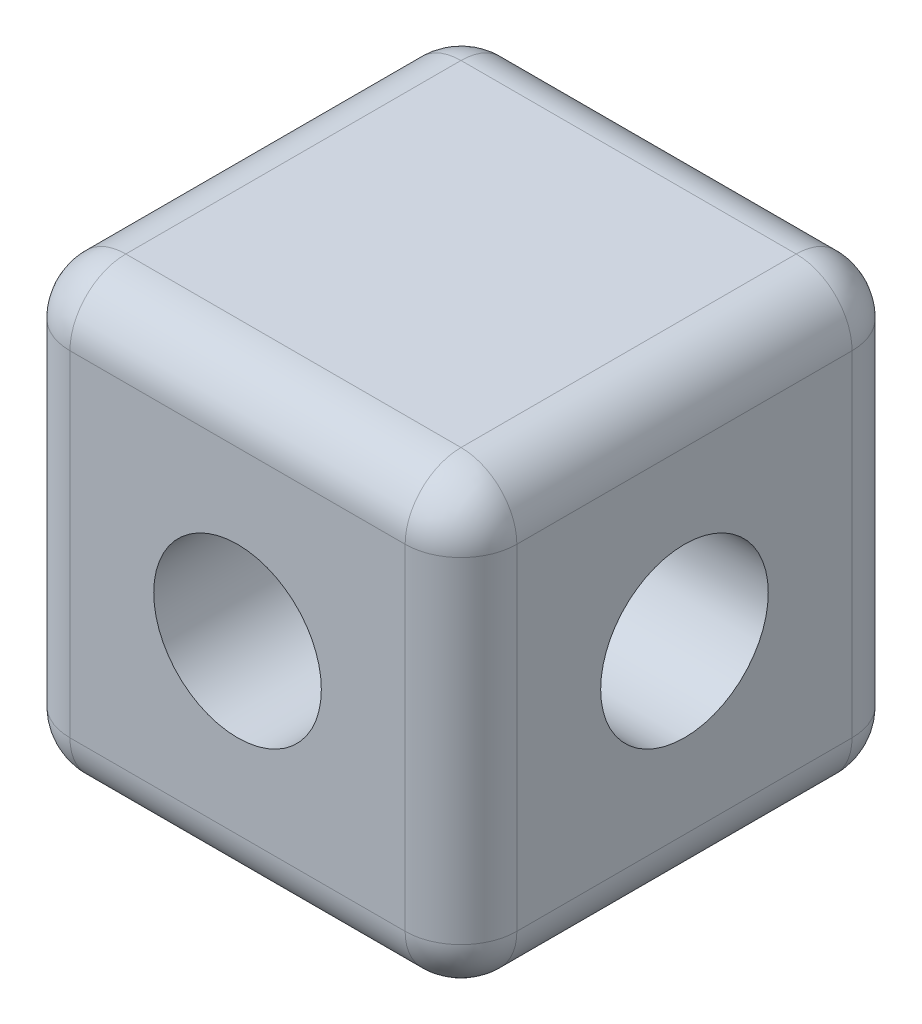
ISO-10303-21;
HEADER;
FILE_DESCRIPTION(('STEP AP214'),'2;1');
FILE_NAME('part.step','',(''),(''),'','','');
FILE_SCHEMA(('AUTOMOTIVE_DESIGN { 1 0 10303 214 1 1 1 1 }'));
ENDSEC;
DATA;
#1=APPLICATION_CONTEXT('core data for automotive mechanical design processes');
#2=APPLICATION_PROTOCOL_DEFINITION('international standard','automotive_design',2000,#1);
#3=PRODUCT_CONTEXT('',#1,'mechanical');
#4=PRODUCT('Part','Part','',(#3));
#5=PRODUCT_RELATED_PRODUCT_CATEGORY('part','',(#4));
#6=PRODUCT_DEFINITION_FORMATION('','',#4);
#7=PRODUCT_DEFINITION_CONTEXT('part definition',#1,'design');
#8=PRODUCT_DEFINITION('design','',#6,#7);
#9=PRODUCT_DEFINITION_SHAPE('','',#8);
#10=(LENGTH_UNIT() NAMED_UNIT(*) SI_UNIT(.MILLI.,.METRE.));
#11=(NAMED_UNIT(*) PLANE_ANGLE_UNIT() SI_UNIT($,.RADIAN.));
#12=(NAMED_UNIT(*) SI_UNIT($,.STERADIAN.) SOLID_ANGLE_UNIT());
#13=UNCERTAINTY_MEASURE_WITH_UNIT(LENGTH_MEASURE(1.E-05),#10,'distance_accuracy_value','');
#14=(GEOMETRIC_REPRESENTATION_CONTEXT(3) GLOBAL_UNCERTAINTY_ASSIGNED_CONTEXT((#13)) GLOBAL_UNIT_ASSIGNED_CONTEXT((#10,
#11,#12)) REPRESENTATION_CONTEXT('',''));
#15=CARTESIAN_POINT('',(0.,0.,0.));
#16=DIRECTION('',(0.,0.,1.));
#17=DIRECTION('',(1.,0.,0.));
#18=AXIS2_PLACEMENT_3D('',#15,#16,#17);
#19=CARTESIAN_POINT('',(0.,2.,-2.001));
#20=DIRECTION('',(0.,0.,1.));
#21=DIRECTION('',(1.,0.,0.));
#22=AXIS2_PLACEMENT_3D('',#19,#20,#21);
#23=CYLINDRICAL_SURFACE('',#22,0.75);
#24=CARTESIAN_POINT('',(0.,2.,2.));
#25=DIRECTION('',(0.,0.,1.));
#26=DIRECTION('',(1.,0.,0.));
#27=AXIS2_PLACEMENT_3D('',#24,#25,#26);
#28=CIRCLE('',#27,0.75);
#29=CARTESIAN_POINT('',(0.750000000000001,2.,2.));
#30=VERTEX_POINT('',#29);
#31=EDGE_CURVE('E276',#30,#30,#28,.T.);
#32=ORIENTED_EDGE('',*,*,#31,.T.);
#33=EDGE_LOOP('',(#32));
#34=FACE_BOUND('',#33,.T.);
#35=CARTESIAN_POINT('',(0.,2.,0.));
#36=DIRECTION('',(0.707106781186547,0.,0.707106781186547));
#37=DIRECTION('',(-0.707106781186547,0.,0.707106781186547));
#38=AXIS2_PLACEMENT_3D('',#35,#36,#37);
#39=ELLIPSE('',#38,1.06066017177982,0.75);
#40=CARTESIAN_POINT('',(0.,1.25,0.));
#41=VERTEX_POINT('',#40);
#42=CARTESIAN_POINT('',(0.,2.75,0.));
#43=VERTEX_POINT('',#42);
#44=EDGE_CURVE('E49',#41,#43,#39,.F.);
#45=ORIENTED_EDGE('',*,*,#44,.T.);
#46=CARTESIAN_POINT('',(0.,2.,0.));
#47=DIRECTION('',(-0.707106781186547,0.,0.707106781186547));
#48=DIRECTION('',(0.707106781186547,0.,0.707106781186547));
#49=AXIS2_PLACEMENT_3D('',#46,#47,#48);
#50=ELLIPSE('',#49,1.06066017177982,0.75);
#51=EDGE_CURVE('E11',#43,#41,#50,.F.);
#52=ORIENTED_EDGE('',*,*,#51,.T.);
#53=EDGE_LOOP('',(#45,#52));
#54=FACE_BOUND('',#53,.T.);
#55=ADVANCED_FACE('F36',(#34,#54),#23,.F.);
#56=CARTESIAN_POINT('',(-1.5,0.5,2.));
#57=DIRECTION('',(0.,0.,-1.));
#58=DIRECTION('',(-1.,0.,0.));
#59=AXIS2_PLACEMENT_3D('',#56,#57,#58);
#60=CYLINDRICAL_SURFACE('',#59,0.5);
#61=CARTESIAN_POINT('',(-1.5,0.5,1.5));
#62=DIRECTION('',(0.,0.,1.));
#63=DIRECTION('',(1.,0.,0.));
#64=AXIS2_PLACEMENT_3D('',#61,#62,#63);
#65=CIRCLE('',#64,0.5);
#66=CARTESIAN_POINT('',(-2.,0.5,1.5));
#67=VERTEX_POINT('',#66);
#68=CARTESIAN_POINT('',(-1.5,0.,1.5));
#69=VERTEX_POINT('',#68);
#70=EDGE_CURVE('E139',#67,#69,#65,.T.);
#71=ORIENTED_EDGE('',*,*,#70,.F.);
#72=DIRECTION('',(0.,0.,1.));
#73=VECTOR('',#72,1.);
#74=CARTESIAN_POINT('',(-2.,0.5,2.));
#75=LINE('',#74,#73);
#76=CARTESIAN_POINT('',(-2.,0.5,-1.5));
#77=VERTEX_POINT('',#76);
#78=EDGE_CURVE('E161',#77,#67,#75,.T.);
#79=ORIENTED_EDGE('',*,*,#78,.F.);
#80=CARTESIAN_POINT('',(-1.5,0.5,-1.5));
#81=DIRECTION('',(0.,0.,1.));
#82=DIRECTION('',(1.,0.,0.));
#83=AXIS2_PLACEMENT_3D('',#80,#81,#82);
#84=CIRCLE('',#83,0.5);
#85=CARTESIAN_POINT('',(-1.5,0.,-1.5));
#86=VERTEX_POINT('',#85);
#87=EDGE_CURVE('E57',#77,#86,#84,.T.);
#88=ORIENTED_EDGE('',*,*,#87,.T.);
#89=DIRECTION('',(0.,0.,1.));
#90=VECTOR('',#89,1.);
#91=CARTESIAN_POINT('',(-1.5,0.,2.));
#92=LINE('',#91,#90);
#93=EDGE_CURVE('E188',#69,#86,#92,.F.);
#94=ORIENTED_EDGE('',*,*,#93,.F.);
#95=EDGE_LOOP('',(#71,#79,#88,#94));
#96=FACE_BOUND('',#95,.T.);
#97=ADVANCED_FACE('F38',(#96),#60,.T.);
#98=CARTESIAN_POINT('',(-1.5,0.5,-1.5));
#99=DIRECTION('',(0.,-1.,0.));
#100=DIRECTION('',(0.,0.,-1.));
#101=AXIS2_PLACEMENT_3D('',#98,#99,#100);
#102=SPHERICAL_SURFACE('',#101,0.5);
#103=ORIENTED_EDGE('',*,*,#87,.F.);
#104=CARTESIAN_POINT('',(-1.5,0.5,-1.5));
#105=DIRECTION('',(0.,-1.,0.));
#106=DIRECTION('',(0.,0.,-1.));
#107=AXIS2_PLACEMENT_3D('',#104,#105,#106);
#108=CIRCLE('',#107,0.5);
#109=CARTESIAN_POINT('',(-1.5,0.5,-2.));
#110=VERTEX_POINT('',#109);
#111=EDGE_CURVE('E164',#110,#77,#108,.F.);
#112=ORIENTED_EDGE('',*,*,#111,.F.);
#113=CARTESIAN_POINT('',(-1.5,0.5,-1.5));
#114=DIRECTION('',(-1.,0.,0.));
#115=DIRECTION('',(0.,0.,1.));
#116=AXIS2_PLACEMENT_3D('',#113,#114,#115);
#117=CIRCLE('',#116,0.5);
#118=EDGE_CURVE('E146',#110,#86,#117,.T.);
#119=ORIENTED_EDGE('',*,*,#118,.T.);
#120=EDGE_LOOP('',(#103,#112,#119));
#121=FACE_BOUND('',#120,.T.);
#122=ADVANCED_FACE('F301',(#121),#102,.T.);
#123=CARTESIAN_POINT('',(-2.,0.5,-1.5));
#124=DIRECTION('',(1.,0.,0.));
#125=DIRECTION('',(0.,0.,-1.));
#126=AXIS2_PLACEMENT_3D('',#123,#124,#125);
#127=CYLINDRICAL_SURFACE('',#126,0.5);
#128=ORIENTED_EDGE('',*,*,#118,.F.);
#129=DIRECTION('',(-1.,0.,0.));
#130=VECTOR('',#129,1.);
#131=CARTESIAN_POINT('',(-2.,0.5,-2.));
#132=LINE('',#131,#130);
#133=CARTESIAN_POINT('',(1.5,0.5,-2.));
#134=VERTEX_POINT('',#133);
#135=EDGE_CURVE('E167',#134,#110,#132,.T.);
#136=ORIENTED_EDGE('',*,*,#135,.F.);
#137=CARTESIAN_POINT('',(1.5,0.5,-1.5));
#138=DIRECTION('',(-1.,0.,0.));
#139=DIRECTION('',(0.,0.,1.));
#140=AXIS2_PLACEMENT_3D('',#137,#138,#139);
#141=CIRCLE('',#140,0.5);
#142=CARTESIAN_POINT('',(1.5,0.,-1.5));
#143=VERTEX_POINT('',#142);
#144=EDGE_CURVE('E148',#134,#143,#141,.T.);
#145=ORIENTED_EDGE('',*,*,#144,.T.);
#146=DIRECTION('',(-1.,0.,0.));
#147=VECTOR('',#146,1.);
#148=CARTESIAN_POINT('',(-2.,0.,-1.5));
#149=LINE('',#148,#147);
#150=EDGE_CURVE('E185',#86,#143,#149,.F.);
#151=ORIENTED_EDGE('',*,*,#150,.F.);
#152=EDGE_LOOP('',(#128,#136,#145,#151));
#153=FACE_BOUND('',#152,.T.);
#154=ADVANCED_FACE('F398',(#153),#127,.T.);
#155=CARTESIAN_POINT('',(1.5,0.5,-1.5));
#156=DIRECTION('',(0.,-1.,0.));
#157=DIRECTION('',(0.,0.,-1.));
#158=AXIS2_PLACEMENT_3D('',#155,#156,#157);
#159=SPHERICAL_SURFACE('',#158,0.5);
#160=ORIENTED_EDGE('',*,*,#144,.F.);
#161=CARTESIAN_POINT('',(1.5,0.5,-1.5));
#162=DIRECTION('',(0.,1.,0.));
#163=DIRECTION('',(0.,0.,1.));
#164=AXIS2_PLACEMENT_3D('',#161,#162,#163);
#165=CIRCLE('',#164,0.5);
#166=CARTESIAN_POINT('',(2.,0.5,-1.5));
#167=VERTEX_POINT('',#166);
#168=EDGE_CURVE('E170',#167,#134,#165,.T.);
#169=ORIENTED_EDGE('',*,*,#168,.F.);
#170=CARTESIAN_POINT('',(1.5,0.5,-1.5));
#171=DIRECTION('',(0.,0.,-1.));
#172=DIRECTION('',(-1.,0.,0.));
#173=AXIS2_PLACEMENT_3D('',#170,#171,#172);
#174=CIRCLE('',#173,0.5);
#175=EDGE_CURVE('E150',#167,#143,#174,.T.);
#176=ORIENTED_EDGE('',*,*,#175,.T.);
#177=EDGE_LOOP('',(#160,#169,#176));
#178=FACE_BOUND('',#177,.T.);
#179=ADVANCED_FACE('F394',(#178),#159,.T.);
#180=CARTESIAN_POINT('',(1.5,0.5,-2.));
#181=DIRECTION('',(0.,0.,1.));
#182=DIRECTION('',(1.,0.,0.));
#183=AXIS2_PLACEMENT_3D('',#180,#181,#182);
#184=CYLINDRICAL_SURFACE('',#183,0.5);
#185=ORIENTED_EDGE('',*,*,#175,.F.);
#186=DIRECTION('',(0.,0.,-1.));
#187=VECTOR('',#186,1.);
#188=CARTESIAN_POINT('',(2.,0.5,-2.));
#189=LINE('',#188,#187);
#190=CARTESIAN_POINT('',(2.,0.5,1.5));
#191=VERTEX_POINT('',#190);
#192=EDGE_CURVE('E173',#191,#167,#189,.T.);
#193=ORIENTED_EDGE('',*,*,#192,.F.);
#194=CARTESIAN_POINT('',(1.5,0.5,1.5));
#195=DIRECTION('',(0.,0.,-1.));
#196=DIRECTION('',(-1.,0.,0.));
#197=AXIS2_PLACEMENT_3D('',#194,#195,#196);
#198=CIRCLE('',#197,0.5);
#199=CARTESIAN_POINT('',(1.5,0.,1.5));
#200=VERTEX_POINT('',#199);
#201=EDGE_CURVE('E153',#191,#200,#198,.T.);
#202=ORIENTED_EDGE('',*,*,#201,.T.);
#203=DIRECTION('',(0.,0.,-1.));
#204=VECTOR('',#203,1.);
#205=CARTESIAN_POINT('',(1.5,0.,-2.));
#206=LINE('',#205,#204);
#207=EDGE_CURVE('E182',#143,#200,#206,.F.);
#208=ORIENTED_EDGE('',*,*,#207,.F.);
#209=EDGE_LOOP('',(#185,#193,#202,#208));
#210=FACE_BOUND('',#209,.T.);
#211=ADVANCED_FACE('F390',(#210),#184,.T.);
#212=CARTESIAN_POINT('',(1.5,0.5,1.5));
#213=DIRECTION('',(0.,-1.,0.));
#214=DIRECTION('',(0.,0.,-1.));
#215=AXIS2_PLACEMENT_3D('',#212,#213,#214);
#216=SPHERICAL_SURFACE('',#215,0.5);
#217=ORIENTED_EDGE('',*,*,#201,.F.);
#218=CARTESIAN_POINT('',(1.5,0.5,1.5));
#219=DIRECTION('',(0.,1.,0.));
#220=DIRECTION('',(0.,0.,1.));
#221=AXIS2_PLACEMENT_3D('',#218,#219,#220);
#222=CIRCLE('',#221,0.5);
#223=CARTESIAN_POINT('',(1.5,0.5,2.));
#224=VERTEX_POINT('',#223);
#225=EDGE_CURVE('E176',#224,#191,#222,.T.);
#226=ORIENTED_EDGE('',*,*,#225,.F.);
#227=CARTESIAN_POINT('',(1.5,0.5,1.5));
#228=DIRECTION('',(1.,0.,0.));
#229=DIRECTION('',(0.,0.,-1.));
#230=AXIS2_PLACEMENT_3D('',#227,#228,#229);
#231=CIRCLE('',#230,0.5);
#232=EDGE_CURVE('E155',#224,#200,#231,.T.);
#233=ORIENTED_EDGE('',*,*,#232,.T.);
#234=EDGE_LOOP('',(#217,#226,#233));
#235=FACE_BOUND('',#234,.T.);
#236=ADVANCED_FACE('F386',(#235),#216,.T.);
#237=CARTESIAN_POINT('',(2.,0.5,1.5));
#238=DIRECTION('',(-1.,0.,0.));
#239=DIRECTION('',(0.,0.,1.));
#240=AXIS2_PLACEMENT_3D('',#237,#238,#239);
#241=CYLINDRICAL_SURFACE('',#240,0.5);
#242=ORIENTED_EDGE('',*,*,#232,.F.);
#243=DIRECTION('',(1.,0.,0.));
#244=VECTOR('',#243,1.);
#245=CARTESIAN_POINT('',(2.,0.5,2.));
#246=LINE('',#245,#244);
#247=CARTESIAN_POINT('',(-1.5,0.5,2.));
#248=VERTEX_POINT('',#247);
#249=EDGE_CURVE('E191',#248,#224,#246,.T.);
#250=ORIENTED_EDGE('',*,*,#249,.F.);
#251=CARTESIAN_POINT('',(-1.5,0.5,1.5));
#252=DIRECTION('',(1.,0.,0.));
#253=DIRECTION('',(0.,0.,-1.));
#254=AXIS2_PLACEMENT_3D('',#251,#252,#253);
#255=CIRCLE('',#254,0.5);
#256=EDGE_CURVE('E158',#248,#69,#255,.T.);
#257=ORIENTED_EDGE('',*,*,#256,.T.);
#258=DIRECTION('',(1.,0.,0.));
#259=VECTOR('',#258,1.);
#260=CARTESIAN_POINT('',(2.,0.,1.5));
#261=LINE('',#260,#259);
#262=EDGE_CURVE('E179',#200,#69,#261,.F.);
#263=ORIENTED_EDGE('',*,*,#262,.F.);
#264=EDGE_LOOP('',(#242,#250,#257,#263));
#265=FACE_BOUND('',#264,.T.);
#266=ADVANCED_FACE('F382',(#265),#241,.T.);
#267=CARTESIAN_POINT('',(-1.5,0.5,1.5));
#268=DIRECTION('',(0.,-1.,0.));
#269=DIRECTION('',(0.,0.,-1.));
#270=AXIS2_PLACEMENT_3D('',#267,#268,#269);
#271=SPHERICAL_SURFACE('',#270,0.5);
#272=CARTESIAN_POINT('',(-1.5,0.5,1.5));
#273=DIRECTION('',(0.,-1.,0.));
#274=DIRECTION('',(0.,0.,-1.));
#275=AXIS2_PLACEMENT_3D('',#272,#273,#274);
#276=CIRCLE('',#275,0.5);
#277=EDGE_CURVE('E194',#67,#248,#276,.F.);
#278=ORIENTED_EDGE('',*,*,#277,.F.);
#279=ORIENTED_EDGE('',*,*,#70,.T.);
#280=ORIENTED_EDGE('',*,*,#256,.F.);
#281=EDGE_LOOP('',(#278,#279,#280));
#282=FACE_BOUND('',#281,.T.);
#283=ADVANCED_FACE('F375',(#282),#271,.T.);
#284=CARTESIAN_POINT('',(-1.5,3.5,-1.5));
#285=DIRECTION('',(0.,0.,1.));
#286=DIRECTION('',(1.,0.,0.));
#287=AXIS2_PLACEMENT_3D('',#284,#285,#286);
#288=SPHERICAL_SURFACE('',#287,0.5);
#289=CARTESIAN_POINT('',(-1.5,3.5,-1.5));
#290=DIRECTION('',(0.,-1.,0.));
#291=DIRECTION('',(0.,0.,-1.));
#292=AXIS2_PLACEMENT_3D('',#289,#290,#291);
#293=CIRCLE('',#292,0.5);
#294=CARTESIAN_POINT('',(-2.,3.5,-1.5));
#295=VERTEX_POINT('',#294);
#296=CARTESIAN_POINT('',(-1.5,3.5,-2.));
#297=VERTEX_POINT('',#296);
#298=EDGE_CURVE('E197',#295,#297,#293,.T.);
#299=ORIENTED_EDGE('',*,*,#298,.F.);
#300=CARTESIAN_POINT('',(-1.5,3.5,-1.5));
#301=DIRECTION('',(0.,0.,1.));
#302=DIRECTION('',(1.,0.,0.));
#303=AXIS2_PLACEMENT_3D('',#300,#301,#302);
#304=CIRCLE('',#303,0.5);
#305=CARTESIAN_POINT('',(-1.5,4.,-1.5));
#306=VERTEX_POINT('',#305);
#307=EDGE_CURVE('E211',#306,#295,#304,.T.);
#308=ORIENTED_EDGE('',*,*,#307,.F.);
#309=CARTESIAN_POINT('',(-1.5,3.5,-1.5));
#310=DIRECTION('',(-1.,0.,0.));
#311=DIRECTION('',(0.,0.,1.));
#312=AXIS2_PLACEMENT_3D('',#309,#310,#311);
#313=CIRCLE('',#312,0.5);
#314=EDGE_CURVE('E200',#306,#297,#313,.T.);
#315=ORIENTED_EDGE('',*,*,#314,.T.);
#316=EDGE_LOOP('',(#299,#308,#315));
#317=FACE_BOUND('',#316,.T.);
#318=ADVANCED_FACE('F371',(#317),#288,.T.);
#319=CARTESIAN_POINT('',(0.,3.5,-1.5));
#320=DIRECTION('',(-1.,0.,0.));
#321=DIRECTION('',(0.,0.,1.));
#322=AXIS2_PLACEMENT_3D('',#319,#320,#321);
#323=CYLINDRICAL_SURFACE('',#322,0.5);
#324=ORIENTED_EDGE('',*,*,#314,.F.);
#325=DIRECTION('',(-1.,0.,0.));
#326=VECTOR('',#325,1.);
#327=CARTESIAN_POINT('',(0.,4.,-1.5));
#328=LINE('',#327,#326);
#329=CARTESIAN_POINT('',(1.5,4.,-1.5));
#330=VERTEX_POINT('',#329);
#331=EDGE_CURVE('E214',#330,#306,#328,.T.);
#332=ORIENTED_EDGE('',*,*,#331,.F.);
#333=CARTESIAN_POINT('',(1.5,3.5,-1.5));
#334=DIRECTION('',(-1.,0.,0.));
#335=DIRECTION('',(0.,0.,1.));
#336=AXIS2_PLACEMENT_3D('',#333,#334,#335);
#337=CIRCLE('',#336,0.5);
#338=CARTESIAN_POINT('',(1.5,3.5,-2.));
#339=VERTEX_POINT('',#338);
#340=EDGE_CURVE('E203',#330,#339,#337,.T.);
#341=ORIENTED_EDGE('',*,*,#340,.T.);
#342=DIRECTION('',(-1.,0.,0.));
#343=VECTOR('',#342,1.);
#344=CARTESIAN_POINT('',(-2.,3.5,-2.));
#345=LINE('',#344,#343);
#346=EDGE_CURVE('E223',#297,#339,#345,.F.);
#347=ORIENTED_EDGE('',*,*,#346,.F.);
#348=EDGE_LOOP('',(#324,#332,#341,#347));
#349=FACE_BOUND('',#348,.T.);
#350=ADVANCED_FACE('F367',(#349),#323,.T.);
#351=CARTESIAN_POINT('',(1.5,3.5,-1.5));
#352=DIRECTION('',(0.,0.,1.));
#353=DIRECTION('',(1.,0.,0.));
#354=AXIS2_PLACEMENT_3D('',#351,#352,#353);
#355=SPHERICAL_SURFACE('',#354,0.5);
#356=ORIENTED_EDGE('',*,*,#340,.F.);
#357=CARTESIAN_POINT('',(1.5,3.5,-1.5));
#358=DIRECTION('',(0.,0.,-1.));
#359=DIRECTION('',(-1.,0.,0.));
#360=AXIS2_PLACEMENT_3D('',#357,#358,#359);
#361=CIRCLE('',#360,0.5);
#362=CARTESIAN_POINT('',(2.,3.5,-1.5));
#363=VERTEX_POINT('',#362);
#364=EDGE_CURVE('E217',#363,#330,#361,.F.);
#365=ORIENTED_EDGE('',*,*,#364,.F.);
#366=CARTESIAN_POINT('',(1.5,3.5,-1.5));
#367=DIRECTION('',(0.,1.,0.));
#368=DIRECTION('',(0.,0.,1.));
#369=AXIS2_PLACEMENT_3D('',#366,#367,#368);
#370=CIRCLE('',#369,0.5);
#371=EDGE_CURVE('E205',#363,#339,#370,.T.);
#372=ORIENTED_EDGE('',*,*,#371,.T.);
#373=EDGE_LOOP('',(#356,#365,#372));
#374=FACE_BOUND('',#373,.T.);
#375=ADVANCED_FACE('F363',(#374),#355,.T.);
#376=CARTESIAN_POINT('',(1.5,4.,-1.5));
#377=DIRECTION('',(0.,1.,0.));
#378=DIRECTION('',(0.,0.,1.));
#379=AXIS2_PLACEMENT_3D('',#376,#377,#378);
#380=CYLINDRICAL_SURFACE('',#379,0.5);
#381=DIRECTION('',(0.,1.,0.));
#382=VECTOR('',#381,1.);
#383=CARTESIAN_POINT('',(2.,4.,-1.5));
#384=LINE('',#383,#382);
#385=EDGE_CURVE('E228',#167,#363,#384,.T.);
#386=ORIENTED_EDGE('',*,*,#385,.F.);
#387=ORIENTED_EDGE('',*,*,#168,.T.);
#388=DIRECTION('',(0.,1.,0.));
#389=VECTOR('',#388,1.);
#390=CARTESIAN_POINT('',(1.5,4.,-2.));
#391=LINE('',#390,#389);
#392=EDGE_CURVE('E220',#339,#134,#391,.F.);
#393=ORIENTED_EDGE('',*,*,#392,.F.);
#394=ORIENTED_EDGE('',*,*,#371,.F.);
#395=EDGE_LOOP('',(#386,#387,#393,#394));
#396=FACE_BOUND('',#395,.T.);
#397=ADVANCED_FACE('F360',(#396),#380,.T.);
#398=CARTESIAN_POINT('',(-1.5,4.,-1.5));
#399=DIRECTION('',(0.,-1.,0.));
#400=DIRECTION('',(0.,0.,-1.));
#401=AXIS2_PLACEMENT_3D('',#398,#399,#400);
#402=CYLINDRICAL_SURFACE('',#401,0.5);
#403=DIRECTION('',(0.,-1.,0.));
#404=VECTOR('',#403,1.);
#405=CARTESIAN_POINT('',(-1.5,4.,-2.));
#406=LINE('',#405,#404);
#407=EDGE_CURVE('E226',#110,#297,#406,.F.);
#408=ORIENTED_EDGE('',*,*,#407,.F.);
#409=ORIENTED_EDGE('',*,*,#111,.T.);
#410=DIRECTION('',(0.,-1.,0.));
#411=VECTOR('',#410,1.);
#412=CARTESIAN_POINT('',(-2.,4.,-1.5));
#413=LINE('',#412,#411);
#414=EDGE_CURVE('E208',#295,#77,#413,.T.);
#415=ORIENTED_EDGE('',*,*,#414,.F.);
#416=ORIENTED_EDGE('',*,*,#298,.T.);
#417=EDGE_LOOP('',(#408,#409,#415,#416));
#418=FACE_BOUND('',#417,.T.);
#419=ADVANCED_FACE('F355',(#418),#402,.T.);
#420=CARTESIAN_POINT('',(-1.5,3.5,1.5));
#421=DIRECTION('',(1.,0.,0.));
#422=DIRECTION('',(0.,0.,-1.));
#423=AXIS2_PLACEMENT_3D('',#420,#421,#422);
#424=SPHERICAL_SURFACE('',#423,0.5);
#425=CARTESIAN_POINT('',(-1.5,3.5,1.5));
#426=DIRECTION('',(0.,-1.,0.));
#427=DIRECTION('',(0.,0.,-1.));
#428=AXIS2_PLACEMENT_3D('',#425,#426,#427);
#429=CIRCLE('',#428,0.5);
#430=CARTESIAN_POINT('',(-1.5,3.5,2.));
#431=VERTEX_POINT('',#430);
#432=CARTESIAN_POINT('',(-2.,3.5,1.5));
#433=VERTEX_POINT('',#432);
#434=EDGE_CURVE('E230',#431,#433,#429,.T.);
#435=ORIENTED_EDGE('',*,*,#434,.F.);
#436=CARTESIAN_POINT('',(-1.5,3.5,1.5));
#437=DIRECTION('',(1.,0.,0.));
#438=DIRECTION('',(0.,0.,-1.));
#439=AXIS2_PLACEMENT_3D('',#436,#437,#438);
#440=CIRCLE('',#439,0.5);
#441=CARTESIAN_POINT('',(-1.5,4.,1.5));
#442=VERTEX_POINT('',#441);
#443=EDGE_CURVE('E239',#442,#431,#440,.T.);
#444=ORIENTED_EDGE('',*,*,#443,.F.);
#445=CARTESIAN_POINT('',(-1.5,3.5,1.5));
#446=DIRECTION('',(0.,0.,1.));
#447=DIRECTION('',(1.,0.,0.));
#448=AXIS2_PLACEMENT_3D('',#445,#446,#447);
#449=CIRCLE('',#448,0.5);
#450=EDGE_CURVE('E233',#442,#433,#449,.T.);
#451=ORIENTED_EDGE('',*,*,#450,.T.);
#452=EDGE_LOOP('',(#435,#444,#451));
#453=FACE_BOUND('',#452,.T.);
#454=ADVANCED_FACE('F351',(#453),#424,.T.);
#455=CARTESIAN_POINT('',(-1.5,3.5,0.));
#456=DIRECTION('',(0.,0.,1.));
#457=DIRECTION('',(1.,0.,0.));
#458=AXIS2_PLACEMENT_3D('',#455,#456,#457);
#459=CYLINDRICAL_SURFACE('',#458,0.5);
#460=DIRECTION('',(0.,0.,1.));
#461=VECTOR('',#460,1.);
#462=CARTESIAN_POINT('',(-1.5,4.,0.));
#463=LINE('',#462,#461);
#464=EDGE_CURVE('E247',#306,#442,#463,.T.);
#465=ORIENTED_EDGE('',*,*,#464,.F.);
#466=ORIENTED_EDGE('',*,*,#307,.T.);
#467=DIRECTION('',(0.,0.,1.));
#468=VECTOR('',#467,1.);
#469=CARTESIAN_POINT('',(-2.,3.5,2.));
#470=LINE('',#469,#468);
#471=EDGE_CURVE('E242',#433,#295,#470,.F.);
#472=ORIENTED_EDGE('',*,*,#471,.F.);
#473=ORIENTED_EDGE('',*,*,#450,.F.);
#474=EDGE_LOOP('',(#465,#466,#472,#473));
#475=FACE_BOUND('',#474,.T.);
#476=ADVANCED_FACE('F348',(#475),#459,.T.);
#477=CARTESIAN_POINT('',(-1.5,4.,1.5));
#478=DIRECTION('',(0.,-1.,0.));
#479=DIRECTION('',(0.,0.,-1.));
#480=AXIS2_PLACEMENT_3D('',#477,#478,#479);
#481=CYLINDRICAL_SURFACE('',#480,0.5);
#482=DIRECTION('',(0.,-1.,0.));
#483=VECTOR('',#482,1.);
#484=CARTESIAN_POINT('',(-2.,4.,1.5));
#485=LINE('',#484,#483);
#486=EDGE_CURVE('E245',#67,#433,#485,.F.);
#487=ORIENTED_EDGE('',*,*,#486,.F.);
#488=ORIENTED_EDGE('',*,*,#277,.T.);
#489=DIRECTION('',(0.,-1.,0.));
#490=VECTOR('',#489,1.);
#491=CARTESIAN_POINT('',(-1.5,4.,2.));
#492=LINE('',#491,#490);
#493=EDGE_CURVE('E236',#431,#248,#492,.T.);
#494=ORIENTED_EDGE('',*,*,#493,.F.);
#495=ORIENTED_EDGE('',*,*,#434,.T.);
#496=EDGE_LOOP('',(#487,#488,#494,#495));
#497=FACE_BOUND('',#496,.T.);
#498=ADVANCED_FACE('F343',(#497),#481,.T.);
#499=CARTESIAN_POINT('',(1.5,3.5,1.5));
#500=DIRECTION('',(-1.,0.,0.));
#501=DIRECTION('',(0.,0.,1.));
#502=AXIS2_PLACEMENT_3D('',#499,#500,#501);
#503=SPHERICAL_SURFACE('',#502,0.5);
#504=CARTESIAN_POINT('',(1.5,3.5,1.5));
#505=DIRECTION('',(0.,0.,-1.));
#506=DIRECTION('',(-1.,0.,0.));
#507=AXIS2_PLACEMENT_3D('',#504,#505,#506);
#508=CIRCLE('',#507,0.5);
#509=CARTESIAN_POINT('',(1.5,4.,1.5));
#510=VERTEX_POINT('',#509);
#511=CARTESIAN_POINT('',(2.,3.5,1.5));
#512=VERTEX_POINT('',#511);
#513=EDGE_CURVE('E249',#510,#512,#508,.T.);
#514=ORIENTED_EDGE('',*,*,#513,.F.);
#515=CARTESIAN_POINT('',(1.5,3.5,1.5));
#516=DIRECTION('',(1.,0.,0.));
#517=DIRECTION('',(0.,0.,-1.));
#518=AXIS2_PLACEMENT_3D('',#515,#516,#517);
#519=CIRCLE('',#518,0.5);
#520=CARTESIAN_POINT('',(1.5,3.5,2.));
#521=VERTEX_POINT('',#520);
#522=EDGE_CURVE('E258',#521,#510,#519,.F.);
#523=ORIENTED_EDGE('',*,*,#522,.F.);
#524=CARTESIAN_POINT('',(1.5,3.5,1.5));
#525=DIRECTION('',(0.,1.,0.));
#526=DIRECTION('',(0.,0.,1.));
#527=AXIS2_PLACEMENT_3D('',#524,#525,#526);
#528=CIRCLE('',#527,0.5);
#529=EDGE_CURVE('E252',#521,#512,#528,.T.);
#530=ORIENTED_EDGE('',*,*,#529,.T.);
#531=EDGE_LOOP('',(#514,#523,#530));
#532=FACE_BOUND('',#531,.T.);
#533=ADVANCED_FACE('F339',(#532),#503,.T.);
#534=CARTESIAN_POINT('',(1.5,4.,1.5));
#535=DIRECTION('',(0.,1.,0.));
#536=DIRECTION('',(0.,0.,1.));
#537=AXIS2_PLACEMENT_3D('',#534,#535,#536);
#538=CYLINDRICAL_SURFACE('',#537,0.5);
#539=DIRECTION('',(0.,1.,0.));
#540=VECTOR('',#539,1.);
#541=CARTESIAN_POINT('',(1.5,4.,2.));
#542=LINE('',#541,#540);
#543=EDGE_CURVE('E266',#224,#521,#542,.T.);
#544=ORIENTED_EDGE('',*,*,#543,.F.);
#545=ORIENTED_EDGE('',*,*,#225,.T.);
#546=DIRECTION('',(0.,1.,0.));
#547=VECTOR('',#546,1.);
#548=CARTESIAN_POINT('',(2.,4.,1.5));
#549=LINE('',#548,#547);
#550=EDGE_CURVE('E261',#512,#191,#549,.F.);
#551=ORIENTED_EDGE('',*,*,#550,.F.);
#552=ORIENTED_EDGE('',*,*,#529,.F.);
#553=EDGE_LOOP('',(#544,#545,#551,#552));
#554=FACE_BOUND('',#553,.T.);
#555=ADVANCED_FACE('F336',(#554),#538,.T.);
#556=CARTESIAN_POINT('',(1.5,3.5,0.));
#557=DIRECTION('',(0.,0.,-1.));
#558=DIRECTION('',(-1.,0.,0.));
#559=AXIS2_PLACEMENT_3D('',#556,#557,#558);
#560=CYLINDRICAL_SURFACE('',#559,0.5);
#561=DIRECTION('',(0.,0.,-1.));
#562=VECTOR('',#561,1.);
#563=CARTESIAN_POINT('',(2.,3.5,-2.));
#564=LINE('',#563,#562);
#565=EDGE_CURVE('E264',#363,#512,#564,.F.);
#566=ORIENTED_EDGE('',*,*,#565,.F.);
#567=ORIENTED_EDGE('',*,*,#364,.T.);
#568=DIRECTION('',(0.,0.,-1.));
#569=VECTOR('',#568,1.);
#570=CARTESIAN_POINT('',(1.5,4.,0.));
#571=LINE('',#570,#569);
#572=EDGE_CURVE('E255',#510,#330,#571,.T.);
#573=ORIENTED_EDGE('',*,*,#572,.F.);
#574=ORIENTED_EDGE('',*,*,#513,.T.);
#575=EDGE_LOOP('',(#566,#567,#573,#574));
#576=FACE_BOUND('',#575,.T.);
#577=ADVANCED_FACE('F334',(#576),#560,.T.);
#578=CARTESIAN_POINT('',(0.,3.5,1.5));
#579=DIRECTION('',(1.,0.,0.));
#580=DIRECTION('',(0.,0.,-1.));
#581=AXIS2_PLACEMENT_3D('',#578,#579,#580);
#582=CYLINDRICAL_SURFACE('',#581,0.5);
#583=DIRECTION('',(1.,0.,0.));
#584=VECTOR('',#583,1.);
#585=CARTESIAN_POINT('',(0.,4.,1.5));
#586=LINE('',#585,#584);
#587=EDGE_CURVE('E271',#442,#510,#586,.T.);
#588=ORIENTED_EDGE('',*,*,#587,.F.);
#589=ORIENTED_EDGE('',*,*,#443,.T.);
#590=DIRECTION('',(1.,0.,0.));
#591=VECTOR('',#590,1.);
#592=CARTESIAN_POINT('',(2.,3.5,2.));
#593=LINE('',#592,#591);
#594=EDGE_CURVE('E268',#521,#431,#593,.F.);
#595=ORIENTED_EDGE('',*,*,#594,.F.);
#596=ORIENTED_EDGE('',*,*,#522,.T.);
#597=EDGE_LOOP('',(#588,#589,#595,#596));
#598=FACE_BOUND('',#597,.T.);
#599=ADVANCED_FACE('F331',(#598),#582,.T.);
#600=CARTESIAN_POINT('',(2.,4.,-2.));
#601=DIRECTION('',(-1.,0.,0.));
#602=DIRECTION('',(0.,0.,1.));
#603=AXIS2_PLACEMENT_3D('',#600,#601,#602);
#604=PLANE('',#603);
#605=CARTESIAN_POINT('',(2.,2.,0.));
#606=DIRECTION('',(-1.,0.,0.));
#607=DIRECTION('',(0.,0.,1.));
#608=AXIS2_PLACEMENT_3D('',#605,#606,#607);
#609=CIRCLE('',#608,0.75);
#610=CARTESIAN_POINT('',(2.,2.,0.749999999999999));
#611=VERTEX_POINT('',#610);
#612=EDGE_CURVE('E279',#611,#611,#609,.T.);
#613=ORIENTED_EDGE('',*,*,#612,.T.);
#614=EDGE_LOOP('',(#613));
#615=FACE_BOUND('',#614,.T.);
#616=ORIENTED_EDGE('',*,*,#550,.T.);
#617=ORIENTED_EDGE('',*,*,#192,.T.);
#618=ORIENTED_EDGE('',*,*,#385,.T.);
#619=ORIENTED_EDGE('',*,*,#565,.T.);
#620=EDGE_LOOP('',(#616,#617,#618,#619));
#621=FACE_BOUND('',#620,.T.);
#622=ADVANCED_FACE('F286',(#615,#621),#604,.F.);
#623=CARTESIAN_POINT('',(-2.,4.,-2.));
#624=DIRECTION('',(0.,0.,1.));
#625=DIRECTION('',(1.,0.,0.));
#626=AXIS2_PLACEMENT_3D('',#623,#624,#625);
#627=PLANE('',#626);
#628=CARTESIAN_POINT('',(0.,2.,-2.));
#629=DIRECTION('',(0.,0.,1.));
#630=DIRECTION('',(1.,0.,0.));
#631=AXIS2_PLACEMENT_3D('',#628,#629,#630);
#632=CIRCLE('',#631,0.75);
#633=CARTESIAN_POINT('',(0.750000000000001,2.,-2.));
#634=VERTEX_POINT('',#633);
#635=EDGE_CURVE('E273',#634,#634,#632,.F.);
#636=ORIENTED_EDGE('',*,*,#635,.F.);
#637=EDGE_LOOP('',(#636));
#638=FACE_BOUND('',#637,.T.);
#639=ORIENTED_EDGE('',*,*,#392,.T.);
#640=ORIENTED_EDGE('',*,*,#135,.T.);
#641=ORIENTED_EDGE('',*,*,#407,.T.);
#642=ORIENTED_EDGE('',*,*,#346,.T.);
#643=EDGE_LOOP('',(#639,#640,#641,#642));
#644=FACE_BOUND('',#643,.T.);
#645=ADVANCED_FACE('F324',(#638,#644),#627,.F.);
#646=CARTESIAN_POINT('',(-2.,4.,2.));
#647=DIRECTION('',(1.,0.,0.));
#648=DIRECTION('',(0.,0.,-1.));
#649=AXIS2_PLACEMENT_3D('',#646,#647,#648);
#650=PLANE('',#649);
#651=CARTESIAN_POINT('',(-2.,2.,0.));
#652=DIRECTION('',(-1.,0.,0.));
#653=DIRECTION('',(0.,0.,1.));
#654=AXIS2_PLACEMENT_3D('',#651,#652,#653);
#655=CIRCLE('',#654,0.75);
#656=CARTESIAN_POINT('',(-2.,2.,0.749999999999999));
#657=VERTEX_POINT('',#656);
#658=EDGE_CURVE('E280',#657,#657,#655,.T.);
#659=ORIENTED_EDGE('',*,*,#658,.F.);
#660=EDGE_LOOP('',(#659));
#661=FACE_BOUND('',#660,.T.);
#662=ORIENTED_EDGE('',*,*,#414,.T.);
#663=ORIENTED_EDGE('',*,*,#78,.T.);
#664=ORIENTED_EDGE('',*,*,#486,.T.);
#665=ORIENTED_EDGE('',*,*,#471,.T.);
#666=EDGE_LOOP('',(#662,#663,#664,#665));
#667=FACE_BOUND('',#666,.T.);
#668=ADVANCED_FACE('F320',(#661,#667),#650,.F.);
#669=CARTESIAN_POINT('',(2.,4.,2.));
#670=DIRECTION('',(0.,0.,-1.));
#671=DIRECTION('',(-1.,0.,0.));
#672=AXIS2_PLACEMENT_3D('',#669,#670,#671);
#673=PLANE('',#672);
#674=ORIENTED_EDGE('',*,*,#31,.F.);
#675=EDGE_LOOP('',(#674));
#676=FACE_BOUND('',#675,.T.);
#677=ORIENTED_EDGE('',*,*,#493,.T.);
#678=ORIENTED_EDGE('',*,*,#249,.T.);
#679=ORIENTED_EDGE('',*,*,#543,.T.);
#680=ORIENTED_EDGE('',*,*,#594,.T.);
#681=EDGE_LOOP('',(#677,#678,#679,#680));
#682=FACE_BOUND('',#681,.T.);
#683=ADVANCED_FACE('F315',(#676,#682),#673,.F.);
#684=CARTESIAN_POINT('',(0.,4.,0.));
#685=DIRECTION('',(0.,-1.,0.));
#686=DIRECTION('',(0.,0.,-1.));
#687=AXIS2_PLACEMENT_3D('',#684,#685,#686);
#688=PLANE('',#687);
#689=ORIENTED_EDGE('',*,*,#572,.T.);
#690=ORIENTED_EDGE('',*,*,#331,.T.);
#691=ORIENTED_EDGE('',*,*,#464,.T.);
#692=ORIENTED_EDGE('',*,*,#587,.T.);
#693=EDGE_LOOP('',(#689,#690,#691,#692));
#694=FACE_BOUND('',#693,.T.);
#695=ADVANCED_FACE('F309',(#694),#688,.F.);
#696=CARTESIAN_POINT('',(0.,0.,0.));
#697=DIRECTION('',(0.,-1.,0.));
#698=DIRECTION('',(0.,0.,-1.));
#699=AXIS2_PLACEMENT_3D('',#696,#697,#698);
#700=PLANE('',#699);
#701=ORIENTED_EDGE('',*,*,#207,.T.);
#702=ORIENTED_EDGE('',*,*,#262,.T.);
#703=ORIENTED_EDGE('',*,*,#93,.T.);
#704=ORIENTED_EDGE('',*,*,#150,.T.);
#705=EDGE_LOOP('',(#701,#702,#703,#704));
#706=FACE_BOUND('',#705,.T.);
#707=ADVANCED_FACE('F305',(#706),#700,.T.);
#708=CARTESIAN_POINT('',(0.,2.,0.));
#709=DIRECTION('',(0.707106781186547,0.,0.707106781186547));
#710=DIRECTION('',(-0.707106781186547,0.,0.707106781186547));
#711=AXIS2_PLACEMENT_3D('',#708,#709,#710);
#712=ELLIPSE('',#711,1.06066017177982,0.75);
#713=EDGE_CURVE('E132',#41,#43,#712,.T.);
#714=ORIENTED_EDGE('',*,*,#713,.T.);
#715=CARTESIAN_POINT('',(0.,2.,0.));
#716=DIRECTION('',(-0.707106781186547,0.,0.707106781186547));
#717=DIRECTION('',(0.707106781186547,0.,0.707106781186547));
#718=AXIS2_PLACEMENT_3D('',#715,#716,#717);
#719=ELLIPSE('',#718,1.06066017177982,0.75);
#720=EDGE_CURVE('E44',#43,#41,#719,.T.);
#721=ORIENTED_EDGE('',*,*,#720,.T.);
#722=EDGE_LOOP('',(#714,#721));
#723=FACE_BOUND('',#722,.T.);
#724=ORIENTED_EDGE('',*,*,#635,.T.);
#725=EDGE_LOOP('',(#724));
#726=FACE_BOUND('',#725,.T.);
#727=ADVANCED_FACE('F141',(#723,#726),#23,.F.);
#728=CARTESIAN_POINT('',(2.,2.,0.));
#729=DIRECTION('',(-1.,0.,0.));
#730=DIRECTION('',(0.,0.,1.));
#731=AXIS2_PLACEMENT_3D('',#728,#729,#730);
#732=CYLINDRICAL_SURFACE('',#731,0.75);
#733=ORIENTED_EDGE('',*,*,#658,.T.);
#734=EDGE_LOOP('',(#733));
#735=FACE_BOUND('',#734,.T.);
#736=ORIENTED_EDGE('',*,*,#44,.F.);
#737=ORIENTED_EDGE('',*,*,#720,.F.);
#738=EDGE_LOOP('',(#736,#737));
#739=FACE_BOUND('',#738,.T.);
#740=ADVANCED_FACE('F138',(#735,#739),#732,.F.);
#741=ORIENTED_EDGE('',*,*,#612,.F.);
#742=EDGE_LOOP('',(#741));
#743=FACE_BOUND('',#742,.T.);
#744=ORIENTED_EDGE('',*,*,#713,.F.);
#745=ORIENTED_EDGE('',*,*,#51,.F.);
#746=EDGE_LOOP('',(#744,#745));
#747=FACE_BOUND('',#746,.T.);
#748=ADVANCED_FACE('F133',(#743,#747),#732,.F.);
#749=CLOSED_SHELL('',(#55,#97,#122,#154,#179,#211,#236,#266,#283,#318,#350,#375,#397,#419,#454,
#476,#498,#533,#555,#577,#599,#622,#645,#668,#683,#695,#707,#727,#740,#748));
#750=MANIFOLD_SOLID_BREP('B2',#749);
#751=ADVANCED_BREP_SHAPE_REPRESENTATION('',(#18,#750),#14);
#752=SHAPE_DEFINITION_REPRESENTATION(#9,#751);
ENDSEC;
END-ISO-10303-21;
